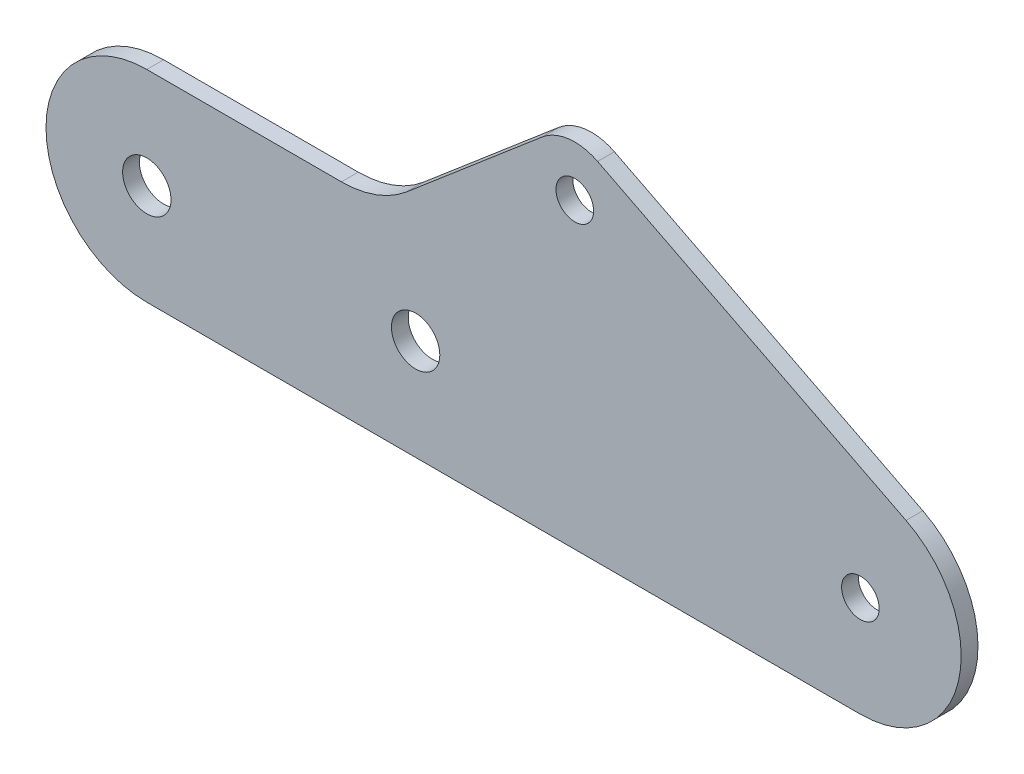
ISO-10303-21;
HEADER;
FILE_DESCRIPTION(('STEP AP214'),'2;1');
FILE_NAME('part.step','',(''),(''),'','','');
FILE_SCHEMA(('AUTOMOTIVE_DESIGN { 1 0 10303 214 1 1 1 1 }'));
ENDSEC;
DATA;
#1=APPLICATION_CONTEXT('core data for automotive mechanical design processes');
#2=APPLICATION_PROTOCOL_DEFINITION('international standard','automotive_design',2000,#1);
#3=PRODUCT_CONTEXT('',#1,'mechanical');
#4=PRODUCT('Part','Part','',(#3));
#5=PRODUCT_RELATED_PRODUCT_CATEGORY('part','',(#4));
#6=PRODUCT_DEFINITION_FORMATION('','',#4);
#7=PRODUCT_DEFINITION_CONTEXT('part definition',#1,'design');
#8=PRODUCT_DEFINITION('design','',#6,#7);
#9=PRODUCT_DEFINITION_SHAPE('','',#8);
#10=(LENGTH_UNIT() NAMED_UNIT(*) SI_UNIT(.MILLI.,.METRE.));
#11=(NAMED_UNIT(*) PLANE_ANGLE_UNIT() SI_UNIT($,.RADIAN.));
#12=(NAMED_UNIT(*) SI_UNIT($,.STERADIAN.) SOLID_ANGLE_UNIT());
#13=UNCERTAINTY_MEASURE_WITH_UNIT(LENGTH_MEASURE(1.E-05),#10,'distance_accuracy_value','');
#14=(GEOMETRIC_REPRESENTATION_CONTEXT(3) GLOBAL_UNCERTAINTY_ASSIGNED_CONTEXT((#13)) GLOBAL_UNIT_ASSIGNED_CONTEXT((#10,
#11,#12)) REPRESENTATION_CONTEXT('',''));
#15=CARTESIAN_POINT('',(0.,0.,0.));
#16=DIRECTION('',(0.,0.,1.));
#17=DIRECTION('',(1.,0.,0.));
#18=AXIS2_PLACEMENT_3D('',#15,#16,#17);
#19=CARTESIAN_POINT('',(-10.9366241433316,19.0499999999987,1.5875));
#20=DIRECTION('',(0.,0.,1.));
#21=DIRECTION('',(1.,0.,0.));
#22=AXIS2_PLACEMENT_3D('',#19,#20,#21);
#23=PLANE('',#22);
#24=CARTESIAN_POINT('',(11.1124999999989,19.0500000000027,1.5875));
#25=DIRECTION('',(0.,0.,1.));
#26=DIRECTION('',(1.,0.,0.));
#27=AXIS2_PLACEMENT_3D('',#24,#25,#26);
#28=CIRCLE('',#27,1.778);
#29=CARTESIAN_POINT('',(12.8904999999989,19.0500000000027,1.5875));
#30=VERTEX_POINT('',#29);
#31=EDGE_CURVE('E193',#30,#30,#28,.T.);
#32=ORIENTED_EDGE('',*,*,#31,.F.);
#33=EDGE_LOOP('',(#32));
#34=FACE_BOUND('',#33,.T.);
#35=CARTESIAN_POINT('',(-3.92950546862945,-6.47631827218178E-13,1.5875));
#36=DIRECTION('',(0.,0.,1.));
#37=DIRECTION('',(1.,0.,0.));
#38=AXIS2_PLACEMENT_3D('',#35,#36,#37);
#39=CIRCLE('',#38,2.28600000000077);
#40=CARTESIAN_POINT('',(-1.64350546862869,-6.47631827218178E-13,1.5875));
#41=VERTEX_POINT('',#40);
#42=EDGE_CURVE('E139',#41,#41,#39,.T.);
#43=ORIENTED_EDGE('',*,*,#42,.F.);
#44=EDGE_LOOP('',(#43));
#45=FACE_BOUND('',#44,.T.);
#46=CARTESIAN_POINT('',(-10.9366241433316,19.0499999999987,1.5875));
#47=DIRECTION('',(0.,0.,-1.));
#48=DIRECTION('',(1.,0.,0.));
#49=AXIS2_PLACEMENT_3D('',#46,#47,#48);
#50=CIRCLE('',#49,9.525);
#51=CARTESIAN_POINT('',(-4.76456775617586,11.7952536258123,1.5875));
#52=VERTEX_POINT('',#51);
#53=CARTESIAN_POINT('',(-10.9366241433316,9.52499999999867,1.5875));
#54=VERTEX_POINT('',#53);
#55=EDGE_CURVE('E151',#52,#54,#50,.T.);
#56=ORIENTED_EDGE('',*,*,#55,.T.);
#57=DIRECTION('',(-1.,0.,0.));
#58=VECTOR('',#57,1.);
#59=CARTESIAN_POINT('',(-29.3295054686295,9.52499999999935,1.5875));
#60=LINE('',#59,#58);
#61=CARTESIAN_POINT('',(-29.3295054686295,9.52499999999935,1.5875));
#62=VERTEX_POINT('',#61);
#63=EDGE_CURVE('E98',#54,#62,#60,.T.);
#64=ORIENTED_EDGE('',*,*,#63,.T.);
#65=CARTESIAN_POINT('',(-29.3295054686295,-6.52000980193578E-13,1.5875));
#66=DIRECTION('',(0.,0.,1.));
#67=DIRECTION('',(1.,0.,0.));
#68=AXIS2_PLACEMENT_3D('',#65,#66,#67);
#69=CIRCLE('',#68,9.52499999999935);
#70=CARTESIAN_POINT('',(-29.3295054686295,-9.525,1.5875));
#71=VERTEX_POINT('',#70);
#72=EDGE_CURVE('E166',#62,#71,#69,.T.);
#73=ORIENTED_EDGE('',*,*,#72,.T.);
#74=DIRECTION('',(1.,-1.05381036355604E-13,0.));
#75=VECTOR('',#74,1.);
#76=CARTESIAN_POINT('',(-29.3295054686295,-9.52499999999935,1.5875));
#77=LINE('',#76,#75);
#78=CARTESIAN_POINT('',(38.0999999999989,-9.52500000000135,1.5875));
#79=VERTEX_POINT('',#78);
#80=EDGE_CURVE('E178',#71,#79,#77,.T.);
#81=ORIENTED_EDGE('',*,*,#80,.T.);
#82=CARTESIAN_POINT('',(38.0999999999989,-1.34755926592855E-12,1.5875));
#83=DIRECTION('',(0.,0.,1.));
#84=DIRECTION('',(1.,0.,0.));
#85=AXIS2_PLACEMENT_3D('',#82,#83,#84);
#86=CIRCLE('',#85,9.52499999999956);
#87=CARTESIAN_POINT('',(42.4136398388671,8.49223977172677,1.5875));
#88=VERTEX_POINT('',#87);
#89=EDGE_CURVE('E117',#79,#88,#86,.T.);
#90=ORIENTED_EDGE('',*,*,#89,.T.);
#91=DIRECTION('',(-0.891573729315318,0.452875573634498,0.));
#92=VECTOR('',#91,1.);
#93=CARTESIAN_POINT('',(42.4136398388669,8.49223977172638,1.5875));
#94=LINE('',#93,#92);
#95=CARTESIAN_POINT('',(13.2693199194326,23.2961198858669,1.5875));
#96=VERTEX_POINT('',#95);
#97=EDGE_CURVE('E111',#88,#96,#94,.T.);
#98=ORIENTED_EDGE('',*,*,#97,.T.);
#99=CARTESIAN_POINT('',(11.1124999999989,19.0500000000027,1.5875));
#100=DIRECTION('',(0.,0.,1.));
#101=DIRECTION('',(1.,0.,0.));
#102=AXIS2_PLACEMENT_3D('',#99,#100,#101);
#103=CIRCLE('',#102,4.76250000000006);
#104=CARTESIAN_POINT('',(8.02647180642061,22.6773731870956,1.5875));
#105=VERTEX_POINT('',#104);
#106=EDGE_CURVE('E115',#96,#105,#103,.T.);
#107=ORIENTED_EDGE('',*,*,#106,.T.);
#108=DIRECTION('',(-0.761653162644236,-0.647984922536036,0.));
#109=VECTOR('',#108,1.);
#110=CARTESIAN_POINT('',(-4.76456775617586,11.7952536258123,1.5875));
#111=LINE('',#110,#109);
#112=EDGE_CURVE('E55',#105,#52,#111,.T.);
#113=ORIENTED_EDGE('',*,*,#112,.T.);
#114=EDGE_LOOP('',(#56,#64,#73,#81,#90,#98,#107,#113));
#115=FACE_BOUND('',#114,.T.);
#116=CARTESIAN_POINT('',(38.0999999999989,-1.34755926592855E-12,1.5875));
#117=DIRECTION('',(0.,0.,1.));
#118=DIRECTION('',(1.,0.,0.));
#119=AXIS2_PLACEMENT_3D('',#116,#117,#118);
#120=CIRCLE('',#119,1.778);
#121=CARTESIAN_POINT('',(39.8779999999989,-1.34755926592855E-12,1.5875));
#122=VERTEX_POINT('',#121);
#123=EDGE_CURVE('E187',#122,#122,#120,.T.);
#124=ORIENTED_EDGE('',*,*,#123,.F.);
#125=EDGE_LOOP('',(#124));
#126=FACE_BOUND('',#125,.T.);
#127=CARTESIAN_POINT('',(-29.3295054686295,-6.52000980193578E-13,1.5875));
#128=DIRECTION('',(0.,0.,1.));
#129=DIRECTION('',(1.,0.,0.));
#130=AXIS2_PLACEMENT_3D('',#127,#128,#129);
#131=CIRCLE('',#130,2.286);
#132=CARTESIAN_POINT('',(-27.0435054686295,-6.52000980193578E-13,1.5875));
#133=VERTEX_POINT('',#132);
#134=EDGE_CURVE('E199',#133,#133,#131,.T.);
#135=ORIENTED_EDGE('',*,*,#134,.F.);
#136=EDGE_LOOP('',(#135));
#137=FACE_BOUND('',#136,.T.);
#138=ADVANCED_FACE('F38',(#34,#45,#115,#126,#137),#23,.T.);
#139=CARTESIAN_POINT('',(-10.9366241433316,19.0499999999987,0.));
#140=DIRECTION('',(0.,0.,1.));
#141=DIRECTION('',(1.,0.,0.));
#142=AXIS2_PLACEMENT_3D('',#139,#140,#141);
#143=PLANE('',#142);
#144=CARTESIAN_POINT('',(-10.9366241433316,19.0499999999987,0.));
#145=DIRECTION('',(0.,0.,-1.));
#146=DIRECTION('',(1.,0.,0.));
#147=AXIS2_PLACEMENT_3D('',#144,#145,#146);
#148=CIRCLE('',#147,9.525);
#149=CARTESIAN_POINT('',(-4.76456775617586,11.7952536258123,0.));
#150=VERTEX_POINT('',#149);
#151=CARTESIAN_POINT('',(-10.9366241433316,9.52499999999867,0.));
#152=VERTEX_POINT('',#151);
#153=EDGE_CURVE('E135',#150,#152,#148,.T.);
#154=ORIENTED_EDGE('',*,*,#153,.F.);
#155=DIRECTION('',(-0.761653162644236,-0.647984922536036,0.));
#156=VECTOR('',#155,1.);
#157=CARTESIAN_POINT('',(-4.76456775617586,11.7952536258123,0.));
#158=LINE('',#157,#156);
#159=CARTESIAN_POINT('',(8.02647180642061,22.6773731870956,0.));
#160=VERTEX_POINT('',#159);
#161=EDGE_CURVE('E90',#160,#150,#158,.T.);
#162=ORIENTED_EDGE('',*,*,#161,.F.);
#163=CARTESIAN_POINT('',(11.1124999999989,19.0500000000027,0.));
#164=DIRECTION('',(0.,0.,1.));
#165=DIRECTION('',(1.,0.,0.));
#166=AXIS2_PLACEMENT_3D('',#163,#164,#165);
#167=CIRCLE('',#166,4.76250000000006);
#168=CARTESIAN_POINT('',(13.2693199194326,23.2961198858669,0.));
#169=VERTEX_POINT('',#168);
#170=EDGE_CURVE('E84',#169,#160,#167,.T.);
#171=ORIENTED_EDGE('',*,*,#170,.F.);
#172=DIRECTION('',(-0.891573729315318,0.452875573634498,0.));
#173=VECTOR('',#172,1.);
#174=CARTESIAN_POINT('',(42.4136398388669,8.49223977172638,0.));
#175=LINE('',#174,#173);
#176=CARTESIAN_POINT('',(42.4136398388671,8.49223977172677,0.));
#177=VERTEX_POINT('',#176);
#178=EDGE_CURVE('E125',#177,#169,#175,.T.);
#179=ORIENTED_EDGE('',*,*,#178,.F.);
#180=CARTESIAN_POINT('',(38.0999999999989,-1.34755926592855E-12,0.));
#181=DIRECTION('',(0.,0.,1.));
#182=DIRECTION('',(1.,0.,0.));
#183=AXIS2_PLACEMENT_3D('',#180,#181,#182);
#184=CIRCLE('',#183,9.52499999999956);
#185=CARTESIAN_POINT('',(38.0999999999989,-9.52500000000135,0.));
#186=VERTEX_POINT('',#185);
#187=EDGE_CURVE('E146',#186,#177,#184,.T.);
#188=ORIENTED_EDGE('',*,*,#187,.F.);
#189=DIRECTION('',(1.,0.,0.));
#190=VECTOR('',#189,1.);
#191=CARTESIAN_POINT('',(-3.92950546863065,-9.52500000000203,0.));
#192=LINE('',#191,#190);
#193=CARTESIAN_POINT('',(-29.3295054686295,-9.525,0.));
#194=VERTEX_POINT('',#193);
#195=EDGE_CURVE('E144',#194,#186,#192,.T.);
#196=ORIENTED_EDGE('',*,*,#195,.F.);
#197=CARTESIAN_POINT('',(-29.3295054686295,-6.52000980193578E-13,0.));
#198=DIRECTION('',(0.,0.,1.));
#199=DIRECTION('',(1.,0.,0.));
#200=AXIS2_PLACEMENT_3D('',#197,#198,#199);
#201=CIRCLE('',#200,9.52499999999935);
#202=CARTESIAN_POINT('',(-29.3295054686295,9.52499999999935,0.));
#203=VERTEX_POINT('',#202);
#204=EDGE_CURVE('E141',#203,#194,#201,.T.);
#205=ORIENTED_EDGE('',*,*,#204,.F.);
#206=DIRECTION('',(-1.,0.,0.));
#207=VECTOR('',#206,1.);
#208=CARTESIAN_POINT('',(-29.3295054686295,9.52499999999935,0.));
#209=LINE('',#208,#207);
#210=EDGE_CURVE('E138',#152,#203,#209,.T.);
#211=ORIENTED_EDGE('',*,*,#210,.F.);
#212=EDGE_LOOP('',(#154,#162,#171,#179,#188,#196,#205,#211));
#213=FACE_BOUND('',#212,.T.);
#214=CARTESIAN_POINT('',(-3.92950546862945,-6.47631827218178E-13,0.));
#215=DIRECTION('',(0.,0.,1.));
#216=DIRECTION('',(1.,0.,0.));
#217=AXIS2_PLACEMENT_3D('',#214,#215,#216);
#218=CIRCLE('',#217,2.28600000000077);
#219=CARTESIAN_POINT('',(-1.64350546862869,-6.47631827218178E-13,0.));
#220=VERTEX_POINT('',#219);
#221=EDGE_CURVE('E184',#220,#220,#218,.T.);
#222=ORIENTED_EDGE('',*,*,#221,.T.);
#223=EDGE_LOOP('',(#222));
#224=FACE_BOUND('',#223,.T.);
#225=CARTESIAN_POINT('',(38.0999999999989,-1.34755926592855E-12,0.));
#226=DIRECTION('',(0.,0.,1.));
#227=DIRECTION('',(1.,0.,0.));
#228=AXIS2_PLACEMENT_3D('',#225,#226,#227);
#229=CIRCLE('',#228,1.778);
#230=CARTESIAN_POINT('',(39.8779999999989,-1.34755926592855E-12,0.));
#231=VERTEX_POINT('',#230);
#232=EDGE_CURVE('E190',#231,#231,#229,.T.);
#233=ORIENTED_EDGE('',*,*,#232,.T.);
#234=EDGE_LOOP('',(#233));
#235=FACE_BOUND('',#234,.T.);
#236=CARTESIAN_POINT('',(11.1124999999989,19.0500000000027,0.));
#237=DIRECTION('',(0.,0.,1.));
#238=DIRECTION('',(1.,0.,0.));
#239=AXIS2_PLACEMENT_3D('',#236,#237,#238);
#240=CIRCLE('',#239,1.778);
#241=CARTESIAN_POINT('',(12.8904999999989,19.0500000000027,0.));
#242=VERTEX_POINT('',#241);
#243=EDGE_CURVE('E196',#242,#242,#240,.T.);
#244=ORIENTED_EDGE('',*,*,#243,.T.);
#245=EDGE_LOOP('',(#244));
#246=FACE_BOUND('',#245,.T.);
#247=CARTESIAN_POINT('',(-29.3295054686295,-6.52000980193578E-13,0.));
#248=DIRECTION('',(0.,0.,1.));
#249=DIRECTION('',(1.,0.,0.));
#250=AXIS2_PLACEMENT_3D('',#247,#248,#249);
#251=CIRCLE('',#250,2.286);
#252=CARTESIAN_POINT('',(-27.0435054686295,-6.52000980193578E-13,0.));
#253=VERTEX_POINT('',#252);
#254=EDGE_CURVE('E202',#253,#253,#251,.T.);
#255=ORIENTED_EDGE('',*,*,#254,.T.);
#256=EDGE_LOOP('',(#255));
#257=FACE_BOUND('',#256,.T.);
#258=ADVANCED_FACE('F169',(#213,#224,#235,#246,#257),#143,.F.);
#259=CARTESIAN_POINT('',(-10.9366241433316,19.0499999999987,1.5875));
#260=DIRECTION('',(0.,0.,-1.));
#261=DIRECTION('',(-1.,0.,0.));
#262=AXIS2_PLACEMENT_3D('',#259,#260,#261);
#263=CYLINDRICAL_SURFACE('',#262,9.525);
#264=ORIENTED_EDGE('',*,*,#153,.T.);
#265=DIRECTION('',(0.,0.,-1.));
#266=VECTOR('',#265,1.);
#267=CARTESIAN_POINT('',(-10.9366241433316,9.52499999999867,1.5875));
#268=LINE('',#267,#266);
#269=EDGE_CURVE('E11',#54,#152,#268,.T.);
#270=ORIENTED_EDGE('',*,*,#269,.F.);
#271=ORIENTED_EDGE('',*,*,#55,.F.);
#272=DIRECTION('',(0.,0.,-1.));
#273=VECTOR('',#272,1.);
#274=CARTESIAN_POINT('',(-4.76456775617586,11.7952536258123,1.5875));
#275=LINE('',#274,#273);
#276=EDGE_CURVE('E131',#52,#150,#275,.T.);
#277=ORIENTED_EDGE('',*,*,#276,.T.);
#278=EDGE_LOOP('',(#264,#270,#271,#277));
#279=FACE_BOUND('',#278,.T.);
#280=ADVANCED_FACE('F40',(#279),#263,.F.);
#281=CARTESIAN_POINT('',(-29.3295054686295,9.52499999999935,1.5875));
#282=DIRECTION('',(0.,-1.,0.));
#283=DIRECTION('',(1.,0.,0.));
#284=AXIS2_PLACEMENT_3D('',#281,#282,#283);
#285=PLANE('',#284);
#286=ORIENTED_EDGE('',*,*,#210,.T.);
#287=DIRECTION('',(0.,0.,-1.));
#288=VECTOR('',#287,1.);
#289=CARTESIAN_POINT('',(-29.3295054686295,9.52499999999935,1.5875));
#290=LINE('',#289,#288);
#291=EDGE_CURVE('E47',#62,#203,#290,.T.);
#292=ORIENTED_EDGE('',*,*,#291,.F.);
#293=ORIENTED_EDGE('',*,*,#63,.F.);
#294=ORIENTED_EDGE('',*,*,#269,.T.);
#295=EDGE_LOOP('',(#286,#292,#293,#294));
#296=FACE_BOUND('',#295,.T.);
#297=ADVANCED_FACE('F236',(#296),#285,.F.);
#298=CARTESIAN_POINT('',(-29.3295054686295,-6.52000980193578E-13,1.5875));
#299=DIRECTION('',(0.,0.,-1.));
#300=DIRECTION('',(-1.,0.,0.));
#301=AXIS2_PLACEMENT_3D('',#298,#299,#300);
#302=CYLINDRICAL_SURFACE('',#301,9.52499999999935);
#303=ORIENTED_EDGE('',*,*,#204,.T.);
#304=DIRECTION('',(0.,0.,-1.));
#305=VECTOR('',#304,1.);
#306=CARTESIAN_POINT('',(-29.3295054686295,-9.525,1.5875));
#307=LINE('',#306,#305);
#308=EDGE_CURVE('E158',#71,#194,#307,.T.);
#309=ORIENTED_EDGE('',*,*,#308,.F.);
#310=ORIENTED_EDGE('',*,*,#72,.F.);
#311=ORIENTED_EDGE('',*,*,#291,.T.);
#312=EDGE_LOOP('',(#303,#309,#310,#311));
#313=FACE_BOUND('',#312,.T.);
#314=ADVANCED_FACE('F164',(#313),#302,.T.);
#315=CARTESIAN_POINT('',(-3.92950546863065,-9.52500000000203,1.5875));
#316=DIRECTION('',(0.,1.,0.));
#317=DIRECTION('',(-1.,0.,0.));
#318=AXIS2_PLACEMENT_3D('',#315,#316,#317);
#319=PLANE('',#318);
#320=ORIENTED_EDGE('',*,*,#195,.T.);
#321=DIRECTION('',(0.,0.,-1.));
#322=VECTOR('',#321,1.);
#323=CARTESIAN_POINT('',(38.0999999999989,-9.52500000000135,1.5875));
#324=LINE('',#323,#322);
#325=EDGE_CURVE('E155',#79,#186,#324,.T.);
#326=ORIENTED_EDGE('',*,*,#325,.F.);
#327=ORIENTED_EDGE('',*,*,#80,.F.);
#328=ORIENTED_EDGE('',*,*,#308,.T.);
#329=EDGE_LOOP('',(#320,#326,#327,#328));
#330=FACE_BOUND('',#329,.T.);
#331=ADVANCED_FACE('F174',(#330),#319,.F.);
#332=CARTESIAN_POINT('',(38.0999999999989,-1.34755926592855E-12,1.5875));
#333=DIRECTION('',(0.,0.,-1.));
#334=DIRECTION('',(-1.,0.,0.));
#335=AXIS2_PLACEMENT_3D('',#332,#333,#334);
#336=CYLINDRICAL_SURFACE('',#335,9.52499999999956);
#337=ORIENTED_EDGE('',*,*,#187,.T.);
#338=DIRECTION('',(0.,0.,-1.));
#339=VECTOR('',#338,1.);
#340=CARTESIAN_POINT('',(42.4136398388671,8.49223977172677,1.5875));
#341=LINE('',#340,#339);
#342=EDGE_CURVE('E126',#88,#177,#341,.T.);
#343=ORIENTED_EDGE('',*,*,#342,.F.);
#344=ORIENTED_EDGE('',*,*,#89,.F.);
#345=ORIENTED_EDGE('',*,*,#325,.T.);
#346=EDGE_LOOP('',(#337,#343,#344,#345));
#347=FACE_BOUND('',#346,.T.);
#348=ADVANCED_FACE('F177',(#347),#336,.T.);
#349=CARTESIAN_POINT('',(42.4136398388669,8.49223977172638,1.5875));
#350=DIRECTION('',(-0.452875573634498,-0.891573729315318,0.));
#351=DIRECTION('',(0.891573729315318,-0.452875573634498,0.));
#352=AXIS2_PLACEMENT_3D('',#349,#350,#351);
#353=PLANE('',#352);
#354=ORIENTED_EDGE('',*,*,#178,.T.);
#355=DIRECTION('',(0.,0.,-1.));
#356=VECTOR('',#355,1.);
#357=CARTESIAN_POINT('',(13.2693199194326,23.2961198858669,1.5875));
#358=LINE('',#357,#356);
#359=EDGE_CURVE('E122',#96,#169,#358,.T.);
#360=ORIENTED_EDGE('',*,*,#359,.F.);
#361=ORIENTED_EDGE('',*,*,#97,.F.);
#362=ORIENTED_EDGE('',*,*,#342,.T.);
#363=EDGE_LOOP('',(#354,#360,#361,#362));
#364=FACE_BOUND('',#363,.T.);
#365=ADVANCED_FACE('F123',(#364),#353,.F.);
#366=CARTESIAN_POINT('',(11.1124999999989,19.0500000000027,1.5875));
#367=DIRECTION('',(0.,0.,-1.));
#368=DIRECTION('',(-1.,0.,0.));
#369=AXIS2_PLACEMENT_3D('',#366,#367,#368);
#370=CYLINDRICAL_SURFACE('',#369,4.76250000000006);
#371=ORIENTED_EDGE('',*,*,#170,.T.);
#372=DIRECTION('',(0.,0.,-1.));
#373=VECTOR('',#372,1.);
#374=CARTESIAN_POINT('',(8.02647180642061,22.6773731870956,1.5875));
#375=LINE('',#374,#373);
#376=EDGE_CURVE('E127',#105,#160,#375,.T.);
#377=ORIENTED_EDGE('',*,*,#376,.F.);
#378=ORIENTED_EDGE('',*,*,#106,.F.);
#379=ORIENTED_EDGE('',*,*,#359,.T.);
#380=EDGE_LOOP('',(#371,#377,#378,#379));
#381=FACE_BOUND('',#380,.T.);
#382=ADVANCED_FACE('F129',(#381),#370,.T.);
#383=CARTESIAN_POINT('',(-4.76456775617586,11.7952536258123,1.5875));
#384=DIRECTION('',(0.647984922536037,-0.761653162644236,0.));
#385=DIRECTION('',(0.761653162644236,0.647984922536037,0.));
#386=AXIS2_PLACEMENT_3D('',#383,#384,#385);
#387=PLANE('',#386);
#388=ORIENTED_EDGE('',*,*,#161,.T.);
#389=ORIENTED_EDGE('',*,*,#276,.F.);
#390=ORIENTED_EDGE('',*,*,#112,.F.);
#391=ORIENTED_EDGE('',*,*,#376,.T.);
#392=EDGE_LOOP('',(#388,#389,#390,#391));
#393=FACE_BOUND('',#392,.T.);
#394=ADVANCED_FACE('F224',(#393),#387,.F.);
#395=CARTESIAN_POINT('',(-3.92950546862945,-6.47631827218178E-13,1.5875));
#396=DIRECTION('',(0.,0.,-1.));
#397=DIRECTION('',(-1.,0.,0.));
#398=AXIS2_PLACEMENT_3D('',#395,#396,#397);
#399=CYLINDRICAL_SURFACE('',#398,2.28600000000077);
#400=ORIENTED_EDGE('',*,*,#42,.T.);
#401=EDGE_LOOP('',(#400));
#402=FACE_BOUND('',#401,.T.);
#403=ORIENTED_EDGE('',*,*,#221,.F.);
#404=EDGE_LOOP('',(#403));
#405=FACE_BOUND('',#404,.T.);
#406=ADVANCED_FACE('F221',(#402,#405),#399,.F.);
#407=CARTESIAN_POINT('',(38.0999999999989,-1.34755926592855E-12,1.5875));
#408=DIRECTION('',(0.,0.,-1.));
#409=DIRECTION('',(-1.,0.,0.));
#410=AXIS2_PLACEMENT_3D('',#407,#408,#409);
#411=CYLINDRICAL_SURFACE('',#410,1.778);
#412=ORIENTED_EDGE('',*,*,#123,.T.);
#413=EDGE_LOOP('',(#412));
#414=FACE_BOUND('',#413,.T.);
#415=ORIENTED_EDGE('',*,*,#232,.F.);
#416=EDGE_LOOP('',(#415));
#417=FACE_BOUND('',#416,.T.);
#418=ADVANCED_FACE('F300',(#414,#417),#411,.F.);
#419=CARTESIAN_POINT('',(11.1124999999989,19.0500000000027,1.5875));
#420=DIRECTION('',(0.,0.,-1.));
#421=DIRECTION('',(-1.,0.,0.));
#422=AXIS2_PLACEMENT_3D('',#419,#420,#421);
#423=CYLINDRICAL_SURFACE('',#422,1.778);
#424=ORIENTED_EDGE('',*,*,#31,.T.);
#425=EDGE_LOOP('',(#424));
#426=FACE_BOUND('',#425,.T.);
#427=ORIENTED_EDGE('',*,*,#243,.F.);
#428=EDGE_LOOP('',(#427));
#429=FACE_BOUND('',#428,.T.);
#430=ADVANCED_FACE('F308',(#426,#429),#423,.F.);
#431=CARTESIAN_POINT('',(-29.3295054686295,-6.52000980193578E-13,1.5875));
#432=DIRECTION('',(0.,0.,-1.));
#433=DIRECTION('',(-1.,0.,0.));
#434=AXIS2_PLACEMENT_3D('',#431,#432,#433);
#435=CYLINDRICAL_SURFACE('',#434,2.286);
#436=ORIENTED_EDGE('',*,*,#134,.T.);
#437=EDGE_LOOP('',(#436));
#438=FACE_BOUND('',#437,.T.);
#439=ORIENTED_EDGE('',*,*,#254,.F.);
#440=EDGE_LOOP('',(#439));
#441=FACE_BOUND('',#440,.T.);
#442=ADVANCED_FACE('F208',(#438,#441),#435,.F.);
#443=CLOSED_SHELL('',(#138,#258,#280,#297,#314,#331,#348,#365,#382,#394,#406,#418,#430,#442));
#444=MANIFOLD_SOLID_BREP('B2',#443);
#445=ADVANCED_BREP_SHAPE_REPRESENTATION('',(#18,#444),#14);
#446=SHAPE_DEFINITION_REPRESENTATION(#9,#445);
ENDSEC;
END-ISO-10303-21;
